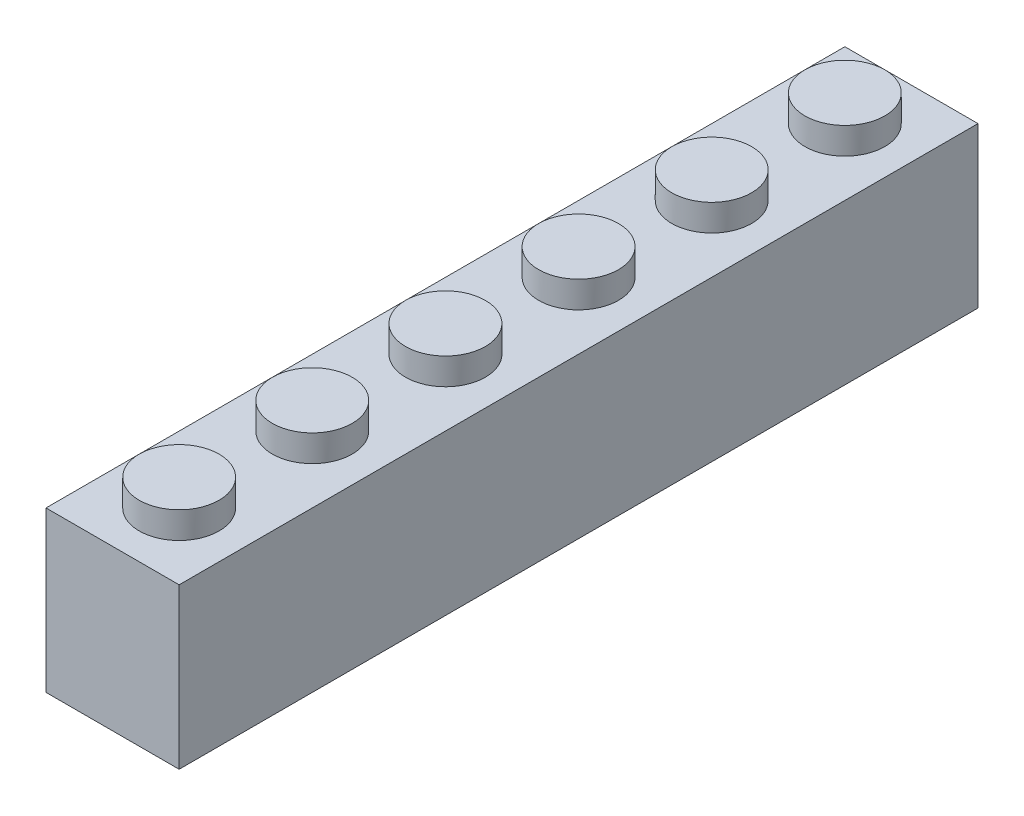
ISO-10303-21;
HEADER;
FILE_DESCRIPTION(('STEP AP214'),'2;1');
FILE_NAME('part.step','',(''),(''),'','','');
FILE_SCHEMA(('AUTOMOTIVE_DESIGN { 1 0 10303 214 1 1 1 1 }'));
ENDSEC;
DATA;
#1=APPLICATION_CONTEXT('core data for automotive mechanical design processes');
#2=APPLICATION_PROTOCOL_DEFINITION('international standard','automotive_design',2000,#1);
#3=PRODUCT_CONTEXT('',#1,'mechanical');
#4=PRODUCT('Part','Part','',(#3));
#5=PRODUCT_RELATED_PRODUCT_CATEGORY('part','',(#4));
#6=PRODUCT_DEFINITION_FORMATION('','',#4);
#7=PRODUCT_DEFINITION_CONTEXT('part definition',#1,'design');
#8=PRODUCT_DEFINITION('design','',#6,#7);
#9=PRODUCT_DEFINITION_SHAPE('','',#8);
#10=(LENGTH_UNIT() NAMED_UNIT(*) SI_UNIT(.MILLI.,.METRE.));
#11=(NAMED_UNIT(*) PLANE_ANGLE_UNIT() SI_UNIT($,.RADIAN.));
#12=(NAMED_UNIT(*) SI_UNIT($,.STERADIAN.) SOLID_ANGLE_UNIT());
#13=UNCERTAINTY_MEASURE_WITH_UNIT(LENGTH_MEASURE(1.E-05),#10,'distance_accuracy_value','');
#14=(GEOMETRIC_REPRESENTATION_CONTEXT(3) GLOBAL_UNCERTAINTY_ASSIGNED_CONTEXT((#13)) GLOBAL_UNIT_ASSIGNED_CONTEXT((#10,
#11,#12)) REPRESENTATION_CONTEXT('',''));
#15=CARTESIAN_POINT('',(0.,0.,0.));
#16=DIRECTION('',(0.,0.,1.));
#17=DIRECTION('',(1.,0.,0.));
#18=AXIS2_PLACEMENT_3D('',#15,#16,#17);
#19=CARTESIAN_POINT('',(0.,0.,0.));
#20=DIRECTION('',(0.,-1.,0.));
#21=DIRECTION('',(0.,0.,-1.));
#22=AXIS2_PLACEMENT_3D('',#19,#20,#21);
#23=PLANE('',#22);
#24=DIRECTION('',(0.,0.,1.));
#25=VECTOR('',#24,1.);
#26=CARTESIAN_POINT('',(0.,0.,0.));
#27=LINE('',#26,#25);
#28=CARTESIAN_POINT('',(0.,0.,-48.));
#29=VERTEX_POINT('',#28);
#30=CARTESIAN_POINT('',(0.,0.,0.));
#31=VERTEX_POINT('',#30);
#32=EDGE_CURVE('E208',#29,#31,#27,.T.);
#33=ORIENTED_EDGE('',*,*,#32,.F.);
#34=DIRECTION('',(-1.,0.,0.));
#35=VECTOR('',#34,1.);
#36=CARTESIAN_POINT('',(0.,0.,-48.));
#37=LINE('',#36,#35);
#38=CARTESIAN_POINT('',(8.,0.,-48.));
#39=VERTEX_POINT('',#38);
#40=EDGE_CURVE('E85',#39,#29,#37,.T.);
#41=ORIENTED_EDGE('',*,*,#40,.F.);
#42=DIRECTION('',(0.,0.,-1.));
#43=VECTOR('',#42,1.);
#44=CARTESIAN_POINT('',(8.,0.,0.));
#45=LINE('',#44,#43);
#46=CARTESIAN_POINT('',(8.,0.,0.));
#47=VERTEX_POINT('',#46);
#48=EDGE_CURVE('E226',#47,#39,#45,.T.);
#49=ORIENTED_EDGE('',*,*,#48,.F.);
#50=DIRECTION('',(1.,0.,0.));
#51=VECTOR('',#50,1.);
#52=CARTESIAN_POINT('',(0.,0.,0.));
#53=LINE('',#52,#51);
#54=EDGE_CURVE('E223',#31,#47,#53,.T.);
#55=ORIENTED_EDGE('',*,*,#54,.F.);
#56=EDGE_LOOP('',(#33,#41,#49,#55));
#57=FACE_BOUND('',#56,.T.);
#58=DIRECTION('',(-1.,0.,0.));
#59=VECTOR('',#58,1.);
#60=CARTESIAN_POINT('',(0.,0.,-46.4));
#61=LINE('',#60,#59);
#62=CARTESIAN_POINT('',(6.4,0.,-46.4));
#63=VERTEX_POINT('',#62);
#64=CARTESIAN_POINT('',(1.6,0.,-46.4));
#65=VERTEX_POINT('',#64);
#66=EDGE_CURVE('E191',#63,#65,#61,.T.);
#67=ORIENTED_EDGE('',*,*,#66,.T.);
#68=DIRECTION('',(0.,0.,1.));
#69=VECTOR('',#68,1.);
#70=CARTESIAN_POINT('',(1.6,0.,0.));
#71=LINE('',#70,#69);
#72=CARTESIAN_POINT('',(1.6,0.,-1.6));
#73=VERTEX_POINT('',#72);
#74=EDGE_CURVE('E182',#65,#73,#71,.T.);
#75=ORIENTED_EDGE('',*,*,#74,.T.);
#76=DIRECTION('',(1.,0.,0.));
#77=VECTOR('',#76,1.);
#78=CARTESIAN_POINT('',(0.,0.,-1.6));
#79=LINE('',#78,#77);
#80=CARTESIAN_POINT('',(6.4,0.,-1.6));
#81=VERTEX_POINT('',#80);
#82=EDGE_CURVE('E190',#73,#81,#79,.T.);
#83=ORIENTED_EDGE('',*,*,#82,.T.);
#84=DIRECTION('',(0.,0.,-1.));
#85=VECTOR('',#84,1.);
#86=CARTESIAN_POINT('',(6.4,0.,0.));
#87=LINE('',#86,#85);
#88=EDGE_CURVE('E55',#81,#63,#87,.T.);
#89=ORIENTED_EDGE('',*,*,#88,.T.);
#90=EDGE_LOOP('',(#67,#75,#83,#89));
#91=FACE_BOUND('',#90,.T.);
#92=ADVANCED_FACE('F39',(#57,#91),#23,.T.);
#93=CARTESIAN_POINT('',(4.,11.2,-44.));
#94=DIRECTION('',(0.,1.,0.));
#95=DIRECTION('',(0.,0.,1.));
#96=AXIS2_PLACEMENT_3D('',#93,#94,#95);
#97=PLANE('',#96);
#98=CARTESIAN_POINT('',(4.,11.2,-44.));
#99=DIRECTION('',(0.,1.,0.));
#100=DIRECTION('',(0.,0.,1.));
#101=AXIS2_PLACEMENT_3D('',#98,#99,#100);
#102=CIRCLE('',#101,2.4);
#103=CARTESIAN_POINT('',(4.,11.2,-41.6));
#104=VERTEX_POINT('',#103);
#105=EDGE_CURVE('E11',#104,#104,#102,.T.);
#106=ORIENTED_EDGE('',*,*,#105,.T.);
#107=EDGE_LOOP('',(#106));
#108=FACE_BOUND('',#107,.T.);
#109=ADVANCED_FACE('F41',(#108),#97,.T.);
#110=CARTESIAN_POINT('',(4.,11.2,-44.));
#111=DIRECTION('',(0.,-1.,0.));
#112=DIRECTION('',(0.,0.,-1.));
#113=AXIS2_PLACEMENT_3D('',#110,#111,#112);
#114=CYLINDRICAL_SURFACE('',#113,2.4);
#115=ORIENTED_EDGE('',*,*,#105,.F.);
#116=EDGE_LOOP('',(#115));
#117=FACE_BOUND('',#116,.T.);
#118=CARTESIAN_POINT('',(4.,9.6,-44.));
#119=DIRECTION('',(0.,-1.,0.));
#120=DIRECTION('',(0.,0.,-1.));
#121=AXIS2_PLACEMENT_3D('',#118,#119,#120);
#122=CIRCLE('',#121,2.4);
#123=CARTESIAN_POINT('',(4.,9.6,-46.4));
#124=VERTEX_POINT('',#123);
#125=EDGE_CURVE('E48',#124,#124,#122,.F.);
#126=ORIENTED_EDGE('',*,*,#125,.T.);
#127=EDGE_LOOP('',(#126));
#128=FACE_BOUND('',#127,.T.);
#129=ADVANCED_FACE('F278',(#117,#128),#114,.T.);
#130=CARTESIAN_POINT('',(4.,11.2,-36.));
#131=DIRECTION('',(0.,1.,0.));
#132=DIRECTION('',(0.,0.,1.));
#133=AXIS2_PLACEMENT_3D('',#130,#131,#132);
#134=PLANE('',#133);
#135=CARTESIAN_POINT('',(4.,11.2,-36.));
#136=DIRECTION('',(0.,1.,0.));
#137=DIRECTION('',(0.,0.,1.));
#138=AXIS2_PLACEMENT_3D('',#135,#136,#137);
#139=CIRCLE('',#138,2.4);
#140=CARTESIAN_POINT('',(4.,11.2,-33.6));
#141=VERTEX_POINT('',#140);
#142=EDGE_CURVE('E271',#141,#141,#139,.T.);
#143=ORIENTED_EDGE('',*,*,#142,.T.);
#144=EDGE_LOOP('',(#143));
#145=FACE_BOUND('',#144,.T.);
#146=ADVANCED_FACE('F336',(#145),#134,.T.);
#147=CARTESIAN_POINT('',(4.,11.2,-36.));
#148=DIRECTION('',(0.,-1.,0.));
#149=DIRECTION('',(0.,0.,-1.));
#150=AXIS2_PLACEMENT_3D('',#147,#148,#149);
#151=CYLINDRICAL_SURFACE('',#150,2.4);
#152=ORIENTED_EDGE('',*,*,#142,.F.);
#153=EDGE_LOOP('',(#152));
#154=FACE_BOUND('',#153,.T.);
#155=CARTESIAN_POINT('',(4.,9.6,-36.));
#156=DIRECTION('',(0.,-1.,0.));
#157=DIRECTION('',(0.,0.,-1.));
#158=AXIS2_PLACEMENT_3D('',#155,#156,#157);
#159=CIRCLE('',#158,2.4);
#160=CARTESIAN_POINT('',(4.,9.6,-38.4));
#161=VERTEX_POINT('',#160);
#162=EDGE_CURVE('E267',#161,#161,#159,.F.);
#163=ORIENTED_EDGE('',*,*,#162,.T.);
#164=EDGE_LOOP('',(#163));
#165=FACE_BOUND('',#164,.T.);
#166=ADVANCED_FACE('F332',(#154,#165),#151,.T.);
#167=CARTESIAN_POINT('',(4.,11.2,-28.));
#168=DIRECTION('',(0.,1.,0.));
#169=DIRECTION('',(0.,0.,1.));
#170=AXIS2_PLACEMENT_3D('',#167,#168,#169);
#171=PLANE('',#170);
#172=CARTESIAN_POINT('',(4.,11.2,-28.));
#173=DIRECTION('',(0.,1.,0.));
#174=DIRECTION('',(0.,0.,1.));
#175=AXIS2_PLACEMENT_3D('',#172,#173,#174);
#176=CIRCLE('',#175,2.4);
#177=CARTESIAN_POINT('',(4.,11.2,-25.6));
#178=VERTEX_POINT('',#177);
#179=EDGE_CURVE('E263',#178,#178,#176,.T.);
#180=ORIENTED_EDGE('',*,*,#179,.T.);
#181=EDGE_LOOP('',(#180));
#182=FACE_BOUND('',#181,.T.);
#183=ADVANCED_FACE('F328',(#182),#171,.T.);
#184=CARTESIAN_POINT('',(4.,11.2,-28.));
#185=DIRECTION('',(0.,-1.,0.));
#186=DIRECTION('',(0.,0.,-1.));
#187=AXIS2_PLACEMENT_3D('',#184,#185,#186);
#188=CYLINDRICAL_SURFACE('',#187,2.4);
#189=ORIENTED_EDGE('',*,*,#179,.F.);
#190=EDGE_LOOP('',(#189));
#191=FACE_BOUND('',#190,.T.);
#192=CARTESIAN_POINT('',(4.,9.6,-28.));
#193=DIRECTION('',(0.,-1.,0.));
#194=DIRECTION('',(0.,0.,-1.));
#195=AXIS2_PLACEMENT_3D('',#192,#193,#194);
#196=CIRCLE('',#195,2.4);
#197=CARTESIAN_POINT('',(4.,9.6,-30.4));
#198=VERTEX_POINT('',#197);
#199=EDGE_CURVE('E259',#198,#198,#196,.F.);
#200=ORIENTED_EDGE('',*,*,#199,.T.);
#201=EDGE_LOOP('',(#200));
#202=FACE_BOUND('',#201,.T.);
#203=ADVANCED_FACE('F324',(#191,#202),#188,.T.);
#204=CARTESIAN_POINT('',(4.,11.2,-20.));
#205=DIRECTION('',(0.,1.,0.));
#206=DIRECTION('',(0.,0.,1.));
#207=AXIS2_PLACEMENT_3D('',#204,#205,#206);
#208=PLANE('',#207);
#209=CARTESIAN_POINT('',(4.,11.2,-20.));
#210=DIRECTION('',(0.,1.,0.));
#211=DIRECTION('',(0.,0.,1.));
#212=AXIS2_PLACEMENT_3D('',#209,#210,#211);
#213=CIRCLE('',#212,2.4);
#214=CARTESIAN_POINT('',(4.,11.2,-17.6));
#215=VERTEX_POINT('',#214);
#216=EDGE_CURVE('E255',#215,#215,#213,.T.);
#217=ORIENTED_EDGE('',*,*,#216,.T.);
#218=EDGE_LOOP('',(#217));
#219=FACE_BOUND('',#218,.T.);
#220=ADVANCED_FACE('F320',(#219),#208,.T.);
#221=CARTESIAN_POINT('',(4.,11.2,-20.));
#222=DIRECTION('',(0.,-1.,0.));
#223=DIRECTION('',(0.,0.,-1.));
#224=AXIS2_PLACEMENT_3D('',#221,#222,#223);
#225=CYLINDRICAL_SURFACE('',#224,2.4);
#226=ORIENTED_EDGE('',*,*,#216,.F.);
#227=EDGE_LOOP('',(#226));
#228=FACE_BOUND('',#227,.T.);
#229=CARTESIAN_POINT('',(4.,9.6,-20.));
#230=DIRECTION('',(0.,-1.,0.));
#231=DIRECTION('',(0.,0.,-1.));
#232=AXIS2_PLACEMENT_3D('',#229,#230,#231);
#233=CIRCLE('',#232,2.4);
#234=CARTESIAN_POINT('',(4.,9.6,-22.4));
#235=VERTEX_POINT('',#234);
#236=EDGE_CURVE('E251',#235,#235,#233,.F.);
#237=ORIENTED_EDGE('',*,*,#236,.T.);
#238=EDGE_LOOP('',(#237));
#239=FACE_BOUND('',#238,.T.);
#240=ADVANCED_FACE('F316',(#228,#239),#225,.T.);
#241=CARTESIAN_POINT('',(0.,9.6,0.));
#242=DIRECTION('',(1.,0.,0.));
#243=DIRECTION('',(0.,0.,-1.));
#244=AXIS2_PLACEMENT_3D('',#241,#242,#243);
#245=PLANE('',#244);
#246=ORIENTED_EDGE('',*,*,#32,.T.);
#247=DIRECTION('',(0.,-1.,0.));
#248=VECTOR('',#247,1.);
#249=CARTESIAN_POINT('',(0.,9.6,0.));
#250=LINE('',#249,#248);
#251=CARTESIAN_POINT('',(0.,9.6,0.));
#252=VERTEX_POINT('',#251);
#253=EDGE_CURVE('E240',#252,#31,#250,.T.);
#254=ORIENTED_EDGE('',*,*,#253,.F.);
#255=DIRECTION('',(0.,0.,1.));
#256=VECTOR('',#255,1.);
#257=CARTESIAN_POINT('',(0.,9.6,0.));
#258=LINE('',#257,#256);
#259=CARTESIAN_POINT('',(0.,9.6,-48.));
#260=VERTEX_POINT('',#259);
#261=EDGE_CURVE('E209',#260,#252,#258,.T.);
#262=ORIENTED_EDGE('',*,*,#261,.F.);
#263=DIRECTION('',(0.,-1.,0.));
#264=VECTOR('',#263,1.);
#265=CARTESIAN_POINT('',(0.,9.6,-48.));
#266=LINE('',#265,#264);
#267=EDGE_CURVE('E219',#260,#29,#266,.T.);
#268=ORIENTED_EDGE('',*,*,#267,.T.);
#269=EDGE_LOOP('',(#246,#254,#262,#268));
#270=FACE_BOUND('',#269,.T.);
#271=ADVANCED_FACE('F313',(#270),#245,.F.);
#272=CARTESIAN_POINT('',(0.,9.6,0.));
#273=DIRECTION('',(0.,0.,-1.));
#274=DIRECTION('',(-1.,0.,0.));
#275=AXIS2_PLACEMENT_3D('',#272,#273,#274);
#276=PLANE('',#275);
#277=ORIENTED_EDGE('',*,*,#54,.T.);
#278=DIRECTION('',(0.,-1.,0.));
#279=VECTOR('',#278,1.);
#280=CARTESIAN_POINT('',(8.,9.6,0.));
#281=LINE('',#280,#279);
#282=CARTESIAN_POINT('',(8.,9.6,0.));
#283=VERTEX_POINT('',#282);
#284=EDGE_CURVE('E236',#283,#47,#281,.T.);
#285=ORIENTED_EDGE('',*,*,#284,.F.);
#286=DIRECTION('',(1.,0.,0.));
#287=VECTOR('',#286,1.);
#288=CARTESIAN_POINT('',(0.,9.6,0.));
#289=LINE('',#288,#287);
#290=EDGE_CURVE('E93',#252,#283,#289,.T.);
#291=ORIENTED_EDGE('',*,*,#290,.F.);
#292=ORIENTED_EDGE('',*,*,#253,.T.);
#293=EDGE_LOOP('',(#277,#285,#291,#292));
#294=FACE_BOUND('',#293,.T.);
#295=ADVANCED_FACE('F309',(#294),#276,.F.);
#296=CARTESIAN_POINT('',(8.,9.6,0.));
#297=DIRECTION('',(-1.,0.,0.));
#298=DIRECTION('',(0.,0.,1.));
#299=AXIS2_PLACEMENT_3D('',#296,#297,#298);
#300=PLANE('',#299);
#301=ORIENTED_EDGE('',*,*,#48,.T.);
#302=DIRECTION('',(0.,-1.,0.));
#303=VECTOR('',#302,1.);
#304=CARTESIAN_POINT('',(8.,9.6,-48.));
#305=LINE('',#304,#303);
#306=CARTESIAN_POINT('',(8.,9.6,-48.));
#307=VERTEX_POINT('',#306);
#308=EDGE_CURVE('E233',#307,#39,#305,.T.);
#309=ORIENTED_EDGE('',*,*,#308,.F.);
#310=DIRECTION('',(0.,0.,-1.));
#311=VECTOR('',#310,1.);
#312=CARTESIAN_POINT('',(8.,9.6,0.));
#313=LINE('',#312,#311);
#314=EDGE_CURVE('E214',#283,#307,#313,.T.);
#315=ORIENTED_EDGE('',*,*,#314,.F.);
#316=ORIENTED_EDGE('',*,*,#284,.T.);
#317=EDGE_LOOP('',(#301,#309,#315,#316));
#318=FACE_BOUND('',#317,.T.);
#319=ADVANCED_FACE('F293',(#318),#300,.F.);
#320=CARTESIAN_POINT('',(0.,9.6,-48.));
#321=DIRECTION('',(0.,0.,1.));
#322=DIRECTION('',(1.,0.,0.));
#323=AXIS2_PLACEMENT_3D('',#320,#321,#322);
#324=PLANE('',#323);
#325=ORIENTED_EDGE('',*,*,#40,.T.);
#326=ORIENTED_EDGE('',*,*,#267,.F.);
#327=DIRECTION('',(-1.,0.,0.));
#328=VECTOR('',#327,1.);
#329=CARTESIAN_POINT('',(0.,9.6,-48.));
#330=LINE('',#329,#328);
#331=EDGE_CURVE('E64',#307,#260,#330,.T.);
#332=ORIENTED_EDGE('',*,*,#331,.F.);
#333=ORIENTED_EDGE('',*,*,#308,.T.);
#334=EDGE_LOOP('',(#325,#326,#332,#333));
#335=FACE_BOUND('',#334,.T.);
#336=ADVANCED_FACE('F283',(#335),#324,.F.);
#337=CARTESIAN_POINT('',(0.,9.6,0.));
#338=DIRECTION('',(0.,-1.,0.));
#339=DIRECTION('',(0.,0.,-1.));
#340=AXIS2_PLACEMENT_3D('',#337,#338,#339);
#341=PLANE('',#340);
#342=CARTESIAN_POINT('',(4.,9.6,-12.));
#343=DIRECTION('',(0.,-1.,0.));
#344=DIRECTION('',(0.,0.,-1.));
#345=AXIS2_PLACEMENT_3D('',#342,#343,#344);
#346=CIRCLE('',#345,2.4);
#347=CARTESIAN_POINT('',(4.,9.6,-14.4));
#348=VERTEX_POINT('',#347);
#349=EDGE_CURVE('E247',#348,#348,#346,.F.);
#350=ORIENTED_EDGE('',*,*,#349,.F.);
#351=EDGE_LOOP('',(#350));
#352=FACE_BOUND('',#351,.T.);
#353=CARTESIAN_POINT('',(4.,9.6,-4.));
#354=DIRECTION('',(0.,-1.,0.));
#355=DIRECTION('',(0.,0.,-1.));
#356=AXIS2_PLACEMENT_3D('',#353,#354,#355);
#357=CIRCLE('',#356,2.4);
#358=CARTESIAN_POINT('',(4.,9.6,-6.4));
#359=VERTEX_POINT('',#358);
#360=EDGE_CURVE('E243',#359,#359,#357,.F.);
#361=ORIENTED_EDGE('',*,*,#360,.F.);
#362=EDGE_LOOP('',(#361));
#363=FACE_BOUND('',#362,.T.);
#364=ORIENTED_EDGE('',*,*,#261,.T.);
#365=ORIENTED_EDGE('',*,*,#290,.T.);
#366=ORIENTED_EDGE('',*,*,#314,.T.);
#367=ORIENTED_EDGE('',*,*,#331,.T.);
#368=EDGE_LOOP('',(#364,#365,#366,#367));
#369=FACE_BOUND('',#368,.T.);
#370=ORIENTED_EDGE('',*,*,#236,.F.);
#371=EDGE_LOOP('',(#370));
#372=FACE_BOUND('',#371,.T.);
#373=ORIENTED_EDGE('',*,*,#199,.F.);
#374=EDGE_LOOP('',(#373));
#375=FACE_BOUND('',#374,.T.);
#376=ORIENTED_EDGE('',*,*,#162,.F.);
#377=EDGE_LOOP('',(#376));
#378=FACE_BOUND('',#377,.T.);
#379=ORIENTED_EDGE('',*,*,#125,.F.);
#380=EDGE_LOOP('',(#379));
#381=FACE_BOUND('',#380,.T.);
#382=ADVANCED_FACE('F280',(#352,#363,#369,#372,#375,#378,#381),#341,.F.);
#383=CARTESIAN_POINT('',(4.,11.2,-4.));
#384=DIRECTION('',(0.,-1.,0.));
#385=DIRECTION('',(0.,0.,-1.));
#386=AXIS2_PLACEMENT_3D('',#383,#384,#385);
#387=CYLINDRICAL_SURFACE('',#386,2.4);
#388=CARTESIAN_POINT('',(4.,11.2,-4.));
#389=DIRECTION('',(0.,1.,0.));
#390=DIRECTION('',(0.,0.,1.));
#391=AXIS2_PLACEMENT_3D('',#388,#389,#390);
#392=CIRCLE('',#391,2.4);
#393=CARTESIAN_POINT('',(4.,11.2,-1.6));
#394=VERTEX_POINT('',#393);
#395=EDGE_CURVE('E203',#394,#394,#392,.T.);
#396=ORIENTED_EDGE('',*,*,#395,.F.);
#397=EDGE_LOOP('',(#396));
#398=FACE_BOUND('',#397,.T.);
#399=ORIENTED_EDGE('',*,*,#360,.T.);
#400=EDGE_LOOP('',(#399));
#401=FACE_BOUND('',#400,.T.);
#402=ADVANCED_FACE('F282',(#398,#401),#387,.T.);
#403=CARTESIAN_POINT('',(4.,11.2,-4.));
#404=DIRECTION('',(0.,1.,0.));
#405=DIRECTION('',(0.,0.,1.));
#406=AXIS2_PLACEMENT_3D('',#403,#404,#405);
#407=PLANE('',#406);
#408=ORIENTED_EDGE('',*,*,#395,.T.);
#409=EDGE_LOOP('',(#408));
#410=FACE_BOUND('',#409,.T.);
#411=ADVANCED_FACE('F290',(#410),#407,.T.);
#412=CARTESIAN_POINT('',(4.,11.2,-12.));
#413=DIRECTION('',(0.,-1.,0.));
#414=DIRECTION('',(0.,0.,-1.));
#415=AXIS2_PLACEMENT_3D('',#412,#413,#414);
#416=CYLINDRICAL_SURFACE('',#415,2.4);
#417=CARTESIAN_POINT('',(4.,11.2,-12.));
#418=DIRECTION('',(0.,1.,0.));
#419=DIRECTION('',(0.,0.,1.));
#420=AXIS2_PLACEMENT_3D('',#417,#418,#419);
#421=CIRCLE('',#420,2.4);
#422=CARTESIAN_POINT('',(4.,11.2,-9.6));
#423=VERTEX_POINT('',#422);
#424=EDGE_CURVE('E199',#423,#423,#421,.T.);
#425=ORIENTED_EDGE('',*,*,#424,.F.);
#426=EDGE_LOOP('',(#425));
#427=FACE_BOUND('',#426,.T.);
#428=ORIENTED_EDGE('',*,*,#349,.T.);
#429=EDGE_LOOP('',(#428));
#430=FACE_BOUND('',#429,.T.);
#431=ADVANCED_FACE('F402',(#427,#430),#416,.T.);
#432=CARTESIAN_POINT('',(4.,11.2,-12.));
#433=DIRECTION('',(0.,1.,0.));
#434=DIRECTION('',(0.,0.,1.));
#435=AXIS2_PLACEMENT_3D('',#432,#433,#434);
#436=PLANE('',#435);
#437=ORIENTED_EDGE('',*,*,#424,.T.);
#438=EDGE_LOOP('',(#437));
#439=FACE_BOUND('',#438,.T.);
#440=ADVANCED_FACE('F432',(#439),#436,.T.);
#441=CARTESIAN_POINT('',(4.,9.6,-44.));
#442=DIRECTION('',(0.,1.,0.));
#443=DIRECTION('',(0.,0.,1.));
#444=AXIS2_PLACEMENT_3D('',#441,#442,#443);
#445=PLANE('',#444);
#446=CARTESIAN_POINT('',(4.,9.6,-44.));
#447=DIRECTION('',(0.,1.,0.));
#448=DIRECTION('',(0.,0.,1.));
#449=AXIS2_PLACEMENT_3D('',#446,#447,#448);
#450=CIRCLE('',#449,0.799999999999999);
#451=CARTESIAN_POINT('',(4.,9.6,-43.2));
#452=VERTEX_POINT('',#451);
#453=EDGE_CURVE('E204',#452,#452,#450,.T.);
#454=ORIENTED_EDGE('',*,*,#453,.F.);
#455=EDGE_LOOP('',(#454));
#456=FACE_BOUND('',#455,.T.);
#457=ADVANCED_FACE('F441',(#456),#445,.F.);
#458=CARTESIAN_POINT('',(4.,11.2,-44.));
#459=DIRECTION('',(0.,-1.,0.));
#460=DIRECTION('',(0.,0.,-1.));
#461=AXIS2_PLACEMENT_3D('',#458,#459,#460);
#462=CYLINDRICAL_SURFACE('',#461,0.799999999999999);
#463=ORIENTED_EDGE('',*,*,#453,.T.);
#464=EDGE_LOOP('',(#463));
#465=FACE_BOUND('',#464,.T.);
#466=CARTESIAN_POINT('',(4.,8.,-44.));
#467=DIRECTION('',(0.,-1.,0.));
#468=DIRECTION('',(0.,0.,-1.));
#469=AXIS2_PLACEMENT_3D('',#466,#467,#468);
#470=CIRCLE('',#469,0.799999999999999);
#471=CARTESIAN_POINT('',(4.,8.,-44.8));
#472=VERTEX_POINT('',#471);
#473=EDGE_CURVE('E164',#472,#472,#470,.F.);
#474=ORIENTED_EDGE('',*,*,#473,.F.);
#475=EDGE_LOOP('',(#474));
#476=FACE_BOUND('',#475,.T.);
#477=ADVANCED_FACE('F454',(#465,#476),#462,.F.);
#478=CARTESIAN_POINT('',(4.,9.6,-36.));
#479=DIRECTION('',(0.,1.,0.));
#480=DIRECTION('',(0.,0.,1.));
#481=AXIS2_PLACEMENT_3D('',#478,#479,#480);
#482=PLANE('',#481);
#483=CARTESIAN_POINT('',(4.,9.6,-36.));
#484=DIRECTION('',(0.,1.,0.));
#485=DIRECTION('',(0.,0.,1.));
#486=AXIS2_PLACEMENT_3D('',#483,#484,#485);
#487=CIRCLE('',#486,0.799999999999999);
#488=CARTESIAN_POINT('',(4.,9.6,-35.2));
#489=VERTEX_POINT('',#488);
#490=EDGE_CURVE('E160',#489,#489,#487,.T.);
#491=ORIENTED_EDGE('',*,*,#490,.F.);
#492=EDGE_LOOP('',(#491));
#493=FACE_BOUND('',#492,.T.);
#494=ADVANCED_FACE('F463',(#493),#482,.F.);
#495=CARTESIAN_POINT('',(4.,11.2,-36.));
#496=DIRECTION('',(0.,-1.,0.));
#497=DIRECTION('',(0.,0.,-1.));
#498=AXIS2_PLACEMENT_3D('',#495,#496,#497);
#499=CYLINDRICAL_SURFACE('',#498,0.799999999999999);
#500=ORIENTED_EDGE('',*,*,#490,.T.);
#501=EDGE_LOOP('',(#500));
#502=FACE_BOUND('',#501,.T.);
#503=CARTESIAN_POINT('',(4.,8.,-36.));
#504=DIRECTION('',(0.,-1.,0.));
#505=DIRECTION('',(0.,0.,-1.));
#506=AXIS2_PLACEMENT_3D('',#503,#504,#505);
#507=CIRCLE('',#506,0.799999999999999);
#508=CARTESIAN_POINT('',(4.,8.,-36.8));
#509=VERTEX_POINT('',#508);
#510=EDGE_CURVE('E156',#509,#509,#507,.F.);
#511=ORIENTED_EDGE('',*,*,#510,.F.);
#512=EDGE_LOOP('',(#511));
#513=FACE_BOUND('',#512,.T.);
#514=ADVANCED_FACE('F472',(#502,#513),#499,.F.);
#515=CARTESIAN_POINT('',(4.,9.6,-28.));
#516=DIRECTION('',(0.,1.,0.));
#517=DIRECTION('',(0.,0.,1.));
#518=AXIS2_PLACEMENT_3D('',#515,#516,#517);
#519=PLANE('',#518);
#520=CARTESIAN_POINT('',(4.,9.6,-28.));
#521=DIRECTION('',(0.,1.,0.));
#522=DIRECTION('',(0.,0.,1.));
#523=AXIS2_PLACEMENT_3D('',#520,#521,#522);
#524=CIRCLE('',#523,0.799999999999999);
#525=CARTESIAN_POINT('',(4.,9.6,-27.2));
#526=VERTEX_POINT('',#525);
#527=EDGE_CURVE('E155',#526,#526,#524,.T.);
#528=ORIENTED_EDGE('',*,*,#527,.F.);
#529=EDGE_LOOP('',(#528));
#530=FACE_BOUND('',#529,.T.);
#531=ADVANCED_FACE('F481',(#530),#519,.F.);
#532=CARTESIAN_POINT('',(4.,11.2,-28.));
#533=DIRECTION('',(0.,-1.,0.));
#534=DIRECTION('',(0.,0.,-1.));
#535=AXIS2_PLACEMENT_3D('',#532,#533,#534);
#536=CYLINDRICAL_SURFACE('',#535,0.799999999999999);
#537=ORIENTED_EDGE('',*,*,#527,.T.);
#538=EDGE_LOOP('',(#537));
#539=FACE_BOUND('',#538,.T.);
#540=CARTESIAN_POINT('',(4.,8.,-28.));
#541=DIRECTION('',(0.,-1.,0.));
#542=DIRECTION('',(0.,0.,-1.));
#543=AXIS2_PLACEMENT_3D('',#540,#541,#542);
#544=CIRCLE('',#543,0.799999999999999);
#545=CARTESIAN_POINT('',(4.,8.,-28.8));
#546=VERTEX_POINT('',#545);
#547=EDGE_CURVE('E151',#546,#546,#544,.F.);
#548=ORIENTED_EDGE('',*,*,#547,.F.);
#549=EDGE_LOOP('',(#548));
#550=FACE_BOUND('',#549,.T.);
#551=ADVANCED_FACE('F490',(#539,#550),#536,.F.);
#552=CARTESIAN_POINT('',(4.,9.6,-20.));
#553=DIRECTION('',(0.,1.,0.));
#554=DIRECTION('',(0.,0.,1.));
#555=AXIS2_PLACEMENT_3D('',#552,#553,#554);
#556=PLANE('',#555);
#557=CARTESIAN_POINT('',(4.,9.6,-20.));
#558=DIRECTION('',(0.,1.,0.));
#559=DIRECTION('',(0.,0.,1.));
#560=AXIS2_PLACEMENT_3D('',#557,#558,#559);
#561=CIRCLE('',#560,0.799999999999999);
#562=CARTESIAN_POINT('',(4.,9.6,-19.2));
#563=VERTEX_POINT('',#562);
#564=EDGE_CURVE('E149',#563,#563,#561,.T.);
#565=ORIENTED_EDGE('',*,*,#564,.F.);
#566=EDGE_LOOP('',(#565));
#567=FACE_BOUND('',#566,.T.);
#568=ADVANCED_FACE('F499',(#567),#556,.F.);
#569=CARTESIAN_POINT('',(4.,11.2,-20.));
#570=DIRECTION('',(0.,-1.,0.));
#571=DIRECTION('',(0.,0.,-1.));
#572=AXIS2_PLACEMENT_3D('',#569,#570,#571);
#573=CYLINDRICAL_SURFACE('',#572,0.799999999999999);
#574=ORIENTED_EDGE('',*,*,#564,.T.);
#575=EDGE_LOOP('',(#574));
#576=FACE_BOUND('',#575,.T.);
#577=CARTESIAN_POINT('',(4.,8.,-20.));
#578=DIRECTION('',(0.,-1.,0.));
#579=DIRECTION('',(0.,0.,-1.));
#580=AXIS2_PLACEMENT_3D('',#577,#578,#579);
#581=CIRCLE('',#580,0.799999999999999);
#582=CARTESIAN_POINT('',(4.,8.,-20.8));
#583=VERTEX_POINT('',#582);
#584=EDGE_CURVE('E145',#583,#583,#581,.F.);
#585=ORIENTED_EDGE('',*,*,#584,.F.);
#586=EDGE_LOOP('',(#585));
#587=FACE_BOUND('',#586,.T.);
#588=ADVANCED_FACE('F508',(#576,#587),#573,.F.);
#589=CARTESIAN_POINT('',(1.6,9.6,0.));
#590=DIRECTION('',(1.,0.,0.));
#591=DIRECTION('',(0.,0.,-1.));
#592=AXIS2_PLACEMENT_3D('',#589,#590,#591);
#593=PLANE('',#592);
#594=ORIENTED_EDGE('',*,*,#74,.F.);
#595=DIRECTION('',(0.,-1.,0.));
#596=VECTOR('',#595,1.);
#597=CARTESIAN_POINT('',(1.6,9.6,-46.4));
#598=LINE('',#597,#596);
#599=CARTESIAN_POINT('',(1.6,8.,-46.4));
#600=VERTEX_POINT('',#599);
#601=EDGE_CURVE('E141',#600,#65,#598,.T.);
#602=ORIENTED_EDGE('',*,*,#601,.F.);
#603=DIRECTION('',(0.,0.,1.));
#604=VECTOR('',#603,1.);
#605=CARTESIAN_POINT('',(1.6,8.,0.));
#606=LINE('',#605,#604);
#607=CARTESIAN_POINT('',(1.6,8.,-1.6));
#608=VERTEX_POINT('',#607);
#609=EDGE_CURVE('E127',#600,#608,#606,.T.);
#610=ORIENTED_EDGE('',*,*,#609,.T.);
#611=DIRECTION('',(0.,-1.,0.));
#612=VECTOR('',#611,1.);
#613=CARTESIAN_POINT('',(1.6,9.6,-1.6));
#614=LINE('',#613,#612);
#615=EDGE_CURVE('E120',#608,#73,#614,.T.);
#616=ORIENTED_EDGE('',*,*,#615,.T.);
#617=EDGE_LOOP('',(#594,#602,#610,#616));
#618=FACE_BOUND('',#617,.T.);
#619=ADVANCED_FACE('F517',(#618),#593,.T.);
#620=CARTESIAN_POINT('',(0.,9.6,-1.6));
#621=DIRECTION('',(0.,0.,-1.));
#622=DIRECTION('',(-1.,0.,0.));
#623=AXIS2_PLACEMENT_3D('',#620,#621,#622);
#624=PLANE('',#623);
#625=ORIENTED_EDGE('',*,*,#82,.F.);
#626=ORIENTED_EDGE('',*,*,#615,.F.);
#627=DIRECTION('',(1.,0.,0.));
#628=VECTOR('',#627,1.);
#629=CARTESIAN_POINT('',(0.,8.,-1.6));
#630=LINE('',#629,#628);
#631=CARTESIAN_POINT('',(6.4,8.,-1.6));
#632=VERTEX_POINT('',#631);
#633=EDGE_CURVE('E115',#608,#632,#630,.T.);
#634=ORIENTED_EDGE('',*,*,#633,.T.);
#635=DIRECTION('',(0.,-1.,0.));
#636=VECTOR('',#635,1.);
#637=CARTESIAN_POINT('',(6.4,9.6,-1.6));
#638=LINE('',#637,#636);
#639=EDGE_CURVE('E117',#632,#81,#638,.T.);
#640=ORIENTED_EDGE('',*,*,#639,.T.);
#641=EDGE_LOOP('',(#625,#626,#634,#640));
#642=FACE_BOUND('',#641,.T.);
#643=ADVANCED_FACE('F116',(#642),#624,.T.);
#644=CARTESIAN_POINT('',(6.4,9.6,0.));
#645=DIRECTION('',(-1.,0.,0.));
#646=DIRECTION('',(0.,0.,1.));
#647=AXIS2_PLACEMENT_3D('',#644,#645,#646);
#648=PLANE('',#647);
#649=ORIENTED_EDGE('',*,*,#88,.F.);
#650=ORIENTED_EDGE('',*,*,#639,.F.);
#651=DIRECTION('',(0.,0.,-1.));
#652=VECTOR('',#651,1.);
#653=CARTESIAN_POINT('',(6.4,8.,0.));
#654=LINE('',#653,#652);
#655=CARTESIAN_POINT('',(6.4,8.,-46.4));
#656=VERTEX_POINT('',#655);
#657=EDGE_CURVE('E126',#632,#656,#654,.T.);
#658=ORIENTED_EDGE('',*,*,#657,.T.);
#659=DIRECTION('',(0.,-1.,0.));
#660=VECTOR('',#659,1.);
#661=CARTESIAN_POINT('',(6.4,9.6,-46.4));
#662=LINE('',#661,#660);
#663=EDGE_CURVE('E132',#656,#63,#662,.T.);
#664=ORIENTED_EDGE('',*,*,#663,.T.);
#665=EDGE_LOOP('',(#649,#650,#658,#664));
#666=FACE_BOUND('',#665,.T.);
#667=ADVANCED_FACE('F129',(#666),#648,.T.);
#668=CARTESIAN_POINT('',(0.,9.6,-46.4));
#669=DIRECTION('',(0.,0.,1.));
#670=DIRECTION('',(1.,0.,0.));
#671=AXIS2_PLACEMENT_3D('',#668,#669,#670);
#672=PLANE('',#671);
#673=ORIENTED_EDGE('',*,*,#66,.F.);
#674=ORIENTED_EDGE('',*,*,#663,.F.);
#675=DIRECTION('',(-1.,0.,0.));
#676=VECTOR('',#675,1.);
#677=CARTESIAN_POINT('',(0.,8.,-46.4));
#678=LINE('',#677,#676);
#679=EDGE_CURVE('E137',#656,#600,#678,.T.);
#680=ORIENTED_EDGE('',*,*,#679,.T.);
#681=ORIENTED_EDGE('',*,*,#601,.T.);
#682=EDGE_LOOP('',(#673,#674,#680,#681));
#683=FACE_BOUND('',#682,.T.);
#684=ADVANCED_FACE('F541',(#683),#672,.T.);
#685=CARTESIAN_POINT('',(0.,8.,0.));
#686=DIRECTION('',(0.,-1.,0.));
#687=DIRECTION('',(0.,0.,-1.));
#688=AXIS2_PLACEMENT_3D('',#685,#686,#687);
#689=PLANE('',#688);
#690=CARTESIAN_POINT('',(4.,8.,-12.));
#691=DIRECTION('',(0.,-1.,0.));
#692=DIRECTION('',(0.,0.,-1.));
#693=AXIS2_PLACEMENT_3D('',#690,#691,#692);
#694=CIRCLE('',#693,0.799999999999999);
#695=CARTESIAN_POINT('',(4.,8.,-12.8));
#696=VERTEX_POINT('',#695);
#697=EDGE_CURVE('E150',#696,#696,#694,.F.);
#698=ORIENTED_EDGE('',*,*,#697,.T.);
#699=EDGE_LOOP('',(#698));
#700=FACE_BOUND('',#699,.T.);
#701=CARTESIAN_POINT('',(4.,8.,-4.));
#702=DIRECTION('',(0.,-1.,0.));
#703=DIRECTION('',(0.,0.,-1.));
#704=AXIS2_PLACEMENT_3D('',#701,#702,#703);
#705=CIRCLE('',#704,0.799999999999999);
#706=CARTESIAN_POINT('',(4.,8.,-4.8));
#707=VERTEX_POINT('',#706);
#708=EDGE_CURVE('E173',#707,#707,#705,.F.);
#709=ORIENTED_EDGE('',*,*,#708,.T.);
#710=EDGE_LOOP('',(#709));
#711=FACE_BOUND('',#710,.T.);
#712=ORIENTED_EDGE('',*,*,#609,.F.);
#713=ORIENTED_EDGE('',*,*,#679,.F.);
#714=ORIENTED_EDGE('',*,*,#657,.F.);
#715=ORIENTED_EDGE('',*,*,#633,.F.);
#716=EDGE_LOOP('',(#712,#713,#714,#715));
#717=FACE_BOUND('',#716,.T.);
#718=ORIENTED_EDGE('',*,*,#584,.T.);
#719=EDGE_LOOP('',(#718));
#720=FACE_BOUND('',#719,.T.);
#721=ORIENTED_EDGE('',*,*,#547,.T.);
#722=EDGE_LOOP('',(#721));
#723=FACE_BOUND('',#722,.T.);
#724=ORIENTED_EDGE('',*,*,#510,.T.);
#725=EDGE_LOOP('',(#724));
#726=FACE_BOUND('',#725,.T.);
#727=ORIENTED_EDGE('',*,*,#473,.T.);
#728=EDGE_LOOP('',(#727));
#729=FACE_BOUND('',#728,.T.);
#730=ADVANCED_FACE('F135',(#700,#711,#717,#720,#723,#726,#729),#689,.T.);
#731=CARTESIAN_POINT('',(4.,11.2,-4.));
#732=DIRECTION('',(0.,-1.,0.));
#733=DIRECTION('',(0.,0.,-1.));
#734=AXIS2_PLACEMENT_3D('',#731,#732,#733);
#735=CYLINDRICAL_SURFACE('',#734,0.799999999999999);
#736=CARTESIAN_POINT('',(4.,9.6,-4.));
#737=DIRECTION('',(0.,1.,0.));
#738=DIRECTION('',(0.,0.,1.));
#739=AXIS2_PLACEMENT_3D('',#736,#737,#738);
#740=CIRCLE('',#739,0.799999999999999);
#741=CARTESIAN_POINT('',(4.,9.6,-3.2));
#742=VERTEX_POINT('',#741);
#743=EDGE_CURVE('E178',#742,#742,#740,.T.);
#744=ORIENTED_EDGE('',*,*,#743,.T.);
#745=EDGE_LOOP('',(#744));
#746=FACE_BOUND('',#745,.T.);
#747=ORIENTED_EDGE('',*,*,#708,.F.);
#748=EDGE_LOOP('',(#747));
#749=FACE_BOUND('',#748,.T.);
#750=ADVANCED_FACE('F557',(#746,#749),#735,.F.);
#751=CARTESIAN_POINT('',(4.,9.6,-4.));
#752=DIRECTION('',(0.,1.,0.));
#753=DIRECTION('',(0.,0.,1.));
#754=AXIS2_PLACEMENT_3D('',#751,#752,#753);
#755=PLANE('',#754);
#756=ORIENTED_EDGE('',*,*,#743,.F.);
#757=EDGE_LOOP('',(#756));
#758=FACE_BOUND('',#757,.T.);
#759=ADVANCED_FACE('F566',(#758),#755,.F.);
#760=CARTESIAN_POINT('',(4.,11.2,-12.));
#761=DIRECTION('',(0.,-1.,0.));
#762=DIRECTION('',(0.,0.,-1.));
#763=AXIS2_PLACEMENT_3D('',#760,#761,#762);
#764=CYLINDRICAL_SURFACE('',#763,0.799999999999999);
#765=CARTESIAN_POINT('',(4.,9.6,-12.));
#766=DIRECTION('',(0.,1.,0.));
#767=DIRECTION('',(0.,0.,1.));
#768=AXIS2_PLACEMENT_3D('',#765,#766,#767);
#769=CIRCLE('',#768,0.799999999999999);
#770=CARTESIAN_POINT('',(4.,9.6,-11.2));
#771=VERTEX_POINT('',#770);
#772=EDGE_CURVE('E183',#771,#771,#769,.T.);
#773=ORIENTED_EDGE('',*,*,#772,.T.);
#774=EDGE_LOOP('',(#773));
#775=FACE_BOUND('',#774,.T.);
#776=ORIENTED_EDGE('',*,*,#697,.F.);
#777=EDGE_LOOP('',(#776));
#778=FACE_BOUND('',#777,.T.);
#779=ADVANCED_FACE('F575',(#775,#778),#764,.F.);
#780=CARTESIAN_POINT('',(4.,9.6,-12.));
#781=DIRECTION('',(0.,1.,0.));
#782=DIRECTION('',(0.,0.,1.));
#783=AXIS2_PLACEMENT_3D('',#780,#781,#782);
#784=PLANE('',#783);
#785=ORIENTED_EDGE('',*,*,#772,.F.);
#786=EDGE_LOOP('',(#785));
#787=FACE_BOUND('',#786,.T.);
#788=ADVANCED_FACE('F584',(#787),#784,.F.);
#789=CLOSED_SHELL('',(#92,#109,#129,#146,#166,#183,#203,#220,#240,#271,#295,#319,#336,#382,#402,
#411,#431,#440,#457,#477,#494,#514,#531,#551,#568,#588,#619,#643,#667,#684,#730,#750,#759,#779,#788));
#790=MANIFOLD_SOLID_BREP('B2',#789);
#791=ADVANCED_BREP_SHAPE_REPRESENTATION('',(#18,#790),#14);
#792=SHAPE_DEFINITION_REPRESENTATION(#9,#791);
ENDSEC;
END-ISO-10303-21;
